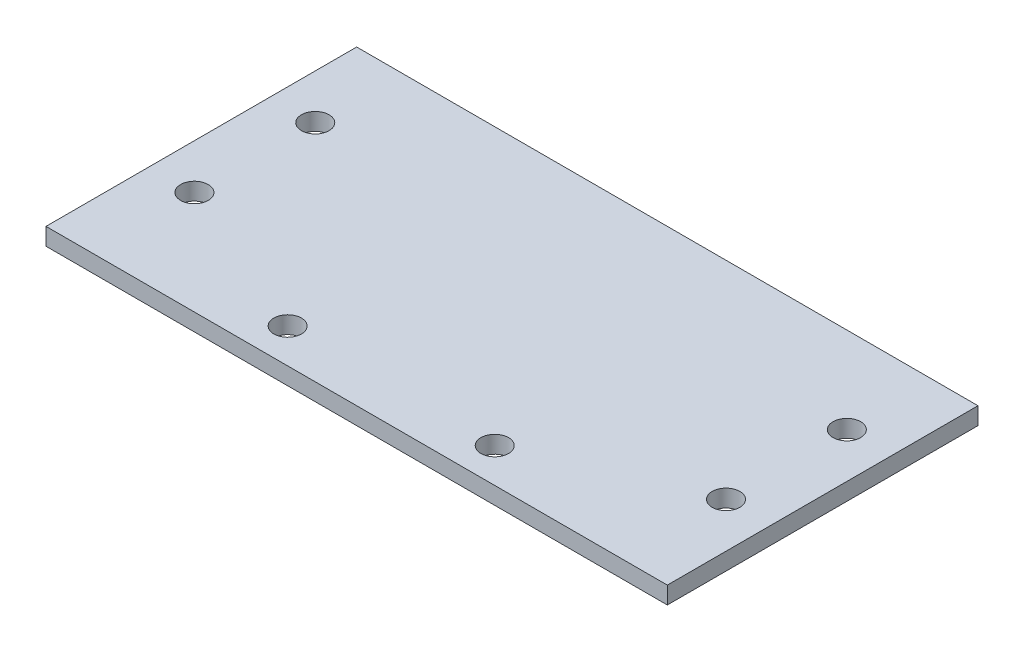
ISO-10303-21;
HEADER;
FILE_DESCRIPTION(('STEP AP214'),'2;1');
FILE_NAME('part.step','',(''),(''),'','','');
FILE_SCHEMA(('AUTOMOTIVE_DESIGN { 1 0 10303 214 1 1 1 1 }'));
ENDSEC;
DATA;
#1=APPLICATION_CONTEXT('core data for automotive mechanical design processes');
#2=APPLICATION_PROTOCOL_DEFINITION('international standard','automotive_design',2000,#1);
#3=PRODUCT_CONTEXT('',#1,'mechanical');
#4=PRODUCT('Part','Part','',(#3));
#5=PRODUCT_RELATED_PRODUCT_CATEGORY('part','',(#4));
#6=PRODUCT_DEFINITION_FORMATION('','',#4);
#7=PRODUCT_DEFINITION_CONTEXT('part definition',#1,'design');
#8=PRODUCT_DEFINITION('design','',#6,#7);
#9=PRODUCT_DEFINITION_SHAPE('','',#8);
#10=(LENGTH_UNIT() NAMED_UNIT(*) SI_UNIT(.MILLI.,.METRE.));
#11=(NAMED_UNIT(*) PLANE_ANGLE_UNIT() SI_UNIT($,.RADIAN.));
#12=(NAMED_UNIT(*) SI_UNIT($,.STERADIAN.) SOLID_ANGLE_UNIT());
#13=UNCERTAINTY_MEASURE_WITH_UNIT(LENGTH_MEASURE(1.E-05),#10,'distance_accuracy_value','');
#14=(GEOMETRIC_REPRESENTATION_CONTEXT(3) GLOBAL_UNCERTAINTY_ASSIGNED_CONTEXT((#13)) GLOBAL_UNIT_ASSIGNED_CONTEXT((#10,
#11,#12)) REPRESENTATION_CONTEXT('',''));
#15=CARTESIAN_POINT('',(0.,0.,0.));
#16=DIRECTION('',(0.,0.,1.));
#17=DIRECTION('',(1.,0.,0.));
#18=AXIS2_PLACEMENT_3D('',#15,#16,#17);
#19=CARTESIAN_POINT('',(0.,2.5,0.));
#20=DIRECTION('',(0.,-1.,0.));
#21=DIRECTION('',(0.,0.,-1.));
#22=AXIS2_PLACEMENT_3D('',#19,#20,#21);
#23=PLANE('',#22);
#24=DIRECTION('',(0.,0.,-1.));
#25=VECTOR('',#24,1.);
#26=CARTESIAN_POINT('',(90.,2.5,45.));
#27=LINE('',#26,#25);
#28=CARTESIAN_POINT('',(90.,2.5,45.));
#29=VERTEX_POINT('',#28);
#30=CARTESIAN_POINT('',(90.,2.5,-45.));
#31=VERTEX_POINT('',#30);
#32=EDGE_CURVE('E91',#29,#31,#27,.T.);
#33=ORIENTED_EDGE('',*,*,#32,.T.);
#34=DIRECTION('',(-1.,0.,0.));
#35=VECTOR('',#34,1.);
#36=CARTESIAN_POINT('',(-90.,2.5,-45.));
#37=LINE('',#36,#35);
#38=CARTESIAN_POINT('',(-90.,2.5,-45.));
#39=VERTEX_POINT('',#38);
#40=EDGE_CURVE('E86',#31,#39,#37,.T.);
#41=ORIENTED_EDGE('',*,*,#40,.T.);
#42=DIRECTION('',(0.,0.,1.));
#43=VECTOR('',#42,1.);
#44=CARTESIAN_POINT('',(-90.,2.5,45.));
#45=LINE('',#44,#43);
#46=CARTESIAN_POINT('',(-90.,2.5,45.));
#47=VERTEX_POINT('',#46);
#48=EDGE_CURVE('E89',#39,#47,#45,.T.);
#49=ORIENTED_EDGE('',*,*,#48,.T.);
#50=DIRECTION('',(1.,0.,0.));
#51=VECTOR('',#50,1.);
#52=CARTESIAN_POINT('',(-90.,2.5,45.));
#53=LINE('',#52,#51);
#54=EDGE_CURVE('E56',#47,#29,#53,.T.);
#55=ORIENTED_EDGE('',*,*,#54,.T.);
#56=EDGE_LOOP('',(#33,#41,#49,#55));
#57=FACE_BOUND('',#56,.T.);
#58=CARTESIAN_POINT('',(-77.,2.5,-20.));
#59=DIRECTION('',(0.,1.,0.));
#60=DIRECTION('',(0.,0.,1.));
#61=AXIS2_PLACEMENT_3D('',#58,#59,#60);
#62=CIRCLE('',#61,4.00000000000001);
#63=CARTESIAN_POINT('',(-77.,2.5,-16.));
#64=VERTEX_POINT('',#63);
#65=EDGE_CURVE('E106',#64,#64,#62,.T.);
#66=ORIENTED_EDGE('',*,*,#65,.F.);
#67=EDGE_LOOP('',(#66));
#68=FACE_BOUND('',#67,.T.);
#69=CARTESIAN_POINT('',(-77.,2.5,15.));
#70=DIRECTION('',(0.,1.,0.));
#71=DIRECTION('',(0.,0.,1.));
#72=AXIS2_PLACEMENT_3D('',#69,#70,#71);
#73=CIRCLE('',#72,4.00000000000001);
#74=CARTESIAN_POINT('',(-77.,2.5,19.));
#75=VERTEX_POINT('',#74);
#76=EDGE_CURVE('E121',#75,#75,#73,.T.);
#77=ORIENTED_EDGE('',*,*,#76,.F.);
#78=EDGE_LOOP('',(#77));
#79=FACE_BOUND('',#78,.T.);
#80=CARTESIAN_POINT('',(-30.,2.5,35.));
#81=DIRECTION('',(0.,1.,0.));
#82=DIRECTION('',(0.,0.,1.));
#83=AXIS2_PLACEMENT_3D('',#80,#81,#82);
#84=CIRCLE('',#83,4.);
#85=CARTESIAN_POINT('',(-30.,2.5,39.));
#86=VERTEX_POINT('',#85);
#87=EDGE_CURVE('E127',#86,#86,#84,.T.);
#88=ORIENTED_EDGE('',*,*,#87,.F.);
#89=EDGE_LOOP('',(#88));
#90=FACE_BOUND('',#89,.T.);
#91=CARTESIAN_POINT('',(30.,2.5,35.));
#92=DIRECTION('',(0.,1.,0.));
#93=DIRECTION('',(0.,0.,-1.));
#94=AXIS2_PLACEMENT_3D('',#91,#92,#93);
#95=CIRCLE('',#94,4.00000000000001);
#96=CARTESIAN_POINT('',(30.,2.5,31.));
#97=VERTEX_POINT('',#96);
#98=EDGE_CURVE('E133',#97,#97,#95,.T.);
#99=ORIENTED_EDGE('',*,*,#98,.F.);
#100=EDGE_LOOP('',(#99));
#101=FACE_BOUND('',#100,.T.);
#102=CARTESIAN_POINT('',(77.,2.5,-20.));
#103=DIRECTION('',(0.,1.,0.));
#104=DIRECTION('',(0.,0.,-1.));
#105=AXIS2_PLACEMENT_3D('',#102,#103,#104);
#106=CIRCLE('',#105,4.00000000000001);
#107=CARTESIAN_POINT('',(77.,2.5,-24.));
#108=VERTEX_POINT('',#107);
#109=EDGE_CURVE('E139',#108,#108,#106,.T.);
#110=ORIENTED_EDGE('',*,*,#109,.F.);
#111=EDGE_LOOP('',(#110));
#112=FACE_BOUND('',#111,.T.);
#113=CARTESIAN_POINT('',(77.,2.5,15.));
#114=DIRECTION('',(0.,1.,0.));
#115=DIRECTION('',(0.,0.,-1.));
#116=AXIS2_PLACEMENT_3D('',#113,#114,#115);
#117=CIRCLE('',#116,4.00000000000001);
#118=CARTESIAN_POINT('',(77.,2.5,11.));
#119=VERTEX_POINT('',#118);
#120=EDGE_CURVE('E145',#119,#119,#117,.T.);
#121=ORIENTED_EDGE('',*,*,#120,.F.);
#122=EDGE_LOOP('',(#121));
#123=FACE_BOUND('',#122,.T.);
#124=ADVANCED_FACE('F39',(#57,#68,#79,#90,#101,#112,#123),#23,.F.);
#125=CARTESIAN_POINT('',(0.,-2.5,0.));
#126=DIRECTION('',(0.,-1.,0.));
#127=DIRECTION('',(0.,0.,-1.));
#128=AXIS2_PLACEMENT_3D('',#125,#126,#127);
#129=PLANE('',#128);
#130=CARTESIAN_POINT('',(77.,-2.5,-20.));
#131=DIRECTION('',(0.,1.,0.));
#132=DIRECTION('',(0.,0.,-1.));
#133=AXIS2_PLACEMENT_3D('',#130,#131,#132);
#134=CIRCLE('',#133,4.00000000000001);
#135=CARTESIAN_POINT('',(77.,-2.5,-24.));
#136=VERTEX_POINT('',#135);
#137=EDGE_CURVE('E142',#136,#136,#134,.T.);
#138=ORIENTED_EDGE('',*,*,#137,.T.);
#139=EDGE_LOOP('',(#138));
#140=FACE_BOUND('',#139,.T.);
#141=CARTESIAN_POINT('',(-30.,-2.5,35.));
#142=DIRECTION('',(0.,1.,0.));
#143=DIRECTION('',(0.,0.,1.));
#144=AXIS2_PLACEMENT_3D('',#141,#142,#143);
#145=CIRCLE('',#144,4.);
#146=CARTESIAN_POINT('',(-30.,-2.5,39.));
#147=VERTEX_POINT('',#146);
#148=EDGE_CURVE('E130',#147,#147,#145,.T.);
#149=ORIENTED_EDGE('',*,*,#148,.T.);
#150=EDGE_LOOP('',(#149));
#151=FACE_BOUND('',#150,.T.);
#152=CARTESIAN_POINT('',(-77.,-2.5,-20.));
#153=DIRECTION('',(0.,1.,0.));
#154=DIRECTION('',(0.,0.,1.));
#155=AXIS2_PLACEMENT_3D('',#152,#153,#154);
#156=CIRCLE('',#155,4.00000000000001);
#157=CARTESIAN_POINT('',(-77.,-2.5,-16.));
#158=VERTEX_POINT('',#157);
#159=EDGE_CURVE('E118',#158,#158,#156,.T.);
#160=ORIENTED_EDGE('',*,*,#159,.T.);
#161=EDGE_LOOP('',(#160));
#162=FACE_BOUND('',#161,.T.);
#163=DIRECTION('',(0.,0.,-1.));
#164=VECTOR('',#163,1.);
#165=CARTESIAN_POINT('',(90.,-2.5,45.));
#166=LINE('',#165,#164);
#167=CARTESIAN_POINT('',(90.,-2.5,45.));
#168=VERTEX_POINT('',#167);
#169=CARTESIAN_POINT('',(90.,-2.5,-45.));
#170=VERTEX_POINT('',#169);
#171=EDGE_CURVE('E103',#168,#170,#166,.T.);
#172=ORIENTED_EDGE('',*,*,#171,.F.);
#173=DIRECTION('',(1.,0.,0.));
#174=VECTOR('',#173,1.);
#175=CARTESIAN_POINT('',(-90.,-2.5,45.));
#176=LINE('',#175,#174);
#177=CARTESIAN_POINT('',(-90.,-2.5,45.));
#178=VERTEX_POINT('',#177);
#179=EDGE_CURVE('E79',#178,#168,#176,.T.);
#180=ORIENTED_EDGE('',*,*,#179,.F.);
#181=DIRECTION('',(0.,0.,1.));
#182=VECTOR('',#181,1.);
#183=CARTESIAN_POINT('',(-90.,-2.5,45.));
#184=LINE('',#183,#182);
#185=CARTESIAN_POINT('',(-90.,-2.5,-45.));
#186=VERTEX_POINT('',#185);
#187=EDGE_CURVE('E73',#186,#178,#184,.T.);
#188=ORIENTED_EDGE('',*,*,#187,.F.);
#189=DIRECTION('',(-1.,0.,0.));
#190=VECTOR('',#189,1.);
#191=CARTESIAN_POINT('',(-90.,-2.5,-45.));
#192=LINE('',#191,#190);
#193=EDGE_CURVE('E95',#170,#186,#192,.T.);
#194=ORIENTED_EDGE('',*,*,#193,.F.);
#195=EDGE_LOOP('',(#172,#180,#188,#194));
#196=FACE_BOUND('',#195,.T.);
#197=CARTESIAN_POINT('',(-77.,-2.5,15.));
#198=DIRECTION('',(0.,1.,0.));
#199=DIRECTION('',(0.,0.,1.));
#200=AXIS2_PLACEMENT_3D('',#197,#198,#199);
#201=CIRCLE('',#200,4.00000000000001);
#202=CARTESIAN_POINT('',(-77.,-2.5,19.));
#203=VERTEX_POINT('',#202);
#204=EDGE_CURVE('E124',#203,#203,#201,.T.);
#205=ORIENTED_EDGE('',*,*,#204,.T.);
#206=EDGE_LOOP('',(#205));
#207=FACE_BOUND('',#206,.T.);
#208=CARTESIAN_POINT('',(30.,-2.5,35.));
#209=DIRECTION('',(0.,1.,0.));
#210=DIRECTION('',(0.,0.,-1.));
#211=AXIS2_PLACEMENT_3D('',#208,#209,#210);
#212=CIRCLE('',#211,4.00000000000001);
#213=CARTESIAN_POINT('',(30.,-2.5,31.));
#214=VERTEX_POINT('',#213);
#215=EDGE_CURVE('E136',#214,#214,#212,.T.);
#216=ORIENTED_EDGE('',*,*,#215,.T.);
#217=EDGE_LOOP('',(#216));
#218=FACE_BOUND('',#217,.T.);
#219=CARTESIAN_POINT('',(77.,-2.5,15.));
#220=DIRECTION('',(0.,1.,0.));
#221=DIRECTION('',(0.,0.,-1.));
#222=AXIS2_PLACEMENT_3D('',#219,#220,#221);
#223=CIRCLE('',#222,4.00000000000001);
#224=CARTESIAN_POINT('',(77.,-2.5,11.));
#225=VERTEX_POINT('',#224);
#226=EDGE_CURVE('E148',#225,#225,#223,.T.);
#227=ORIENTED_EDGE('',*,*,#226,.T.);
#228=EDGE_LOOP('',(#227));
#229=FACE_BOUND('',#228,.T.);
#230=ADVANCED_FACE('F114',(#140,#151,#162,#196,#207,#218,#229),#129,.T.);
#231=CARTESIAN_POINT('',(90.,2.5,45.));
#232=DIRECTION('',(-1.,0.,0.));
#233=DIRECTION('',(0.,0.,1.));
#234=AXIS2_PLACEMENT_3D('',#231,#232,#233);
#235=PLANE('',#234);
#236=ORIENTED_EDGE('',*,*,#171,.T.);
#237=DIRECTION('',(0.,-1.,0.));
#238=VECTOR('',#237,1.);
#239=CARTESIAN_POINT('',(90.,2.5,-45.));
#240=LINE('',#239,#238);
#241=EDGE_CURVE('E11',#31,#170,#240,.T.);
#242=ORIENTED_EDGE('',*,*,#241,.F.);
#243=ORIENTED_EDGE('',*,*,#32,.F.);
#244=DIRECTION('',(0.,-1.,0.));
#245=VECTOR('',#244,1.);
#246=CARTESIAN_POINT('',(90.,2.5,45.));
#247=LINE('',#246,#245);
#248=EDGE_CURVE('E99',#29,#168,#247,.T.);
#249=ORIENTED_EDGE('',*,*,#248,.T.);
#250=EDGE_LOOP('',(#236,#242,#243,#249));
#251=FACE_BOUND('',#250,.T.);
#252=ADVANCED_FACE('F41',(#251),#235,.F.);
#253=CARTESIAN_POINT('',(-90.,2.5,-45.));
#254=DIRECTION('',(0.,0.,1.));
#255=DIRECTION('',(1.,0.,0.));
#256=AXIS2_PLACEMENT_3D('',#253,#254,#255);
#257=PLANE('',#256);
#258=ORIENTED_EDGE('',*,*,#193,.T.);
#259=DIRECTION('',(0.,-1.,0.));
#260=VECTOR('',#259,1.);
#261=CARTESIAN_POINT('',(-90.,2.5,-45.));
#262=LINE('',#261,#260);
#263=EDGE_CURVE('E48',#39,#186,#262,.T.);
#264=ORIENTED_EDGE('',*,*,#263,.F.);
#265=ORIENTED_EDGE('',*,*,#40,.F.);
#266=ORIENTED_EDGE('',*,*,#241,.T.);
#267=EDGE_LOOP('',(#258,#264,#265,#266));
#268=FACE_BOUND('',#267,.T.);
#269=ADVANCED_FACE('F94',(#268),#257,.F.);
#270=CARTESIAN_POINT('',(-90.,2.5,45.));
#271=DIRECTION('',(1.,0.,0.));
#272=DIRECTION('',(0.,0.,-1.));
#273=AXIS2_PLACEMENT_3D('',#270,#271,#272);
#274=PLANE('',#273);
#275=ORIENTED_EDGE('',*,*,#187,.T.);
#276=DIRECTION('',(0.,-1.,0.));
#277=VECTOR('',#276,1.);
#278=CARTESIAN_POINT('',(-90.,2.5,45.));
#279=LINE('',#278,#277);
#280=EDGE_CURVE('E96',#47,#178,#279,.T.);
#281=ORIENTED_EDGE('',*,*,#280,.F.);
#282=ORIENTED_EDGE('',*,*,#48,.F.);
#283=ORIENTED_EDGE('',*,*,#263,.T.);
#284=EDGE_LOOP('',(#275,#281,#282,#283));
#285=FACE_BOUND('',#284,.T.);
#286=ADVANCED_FACE('F97',(#285),#274,.F.);
#287=CARTESIAN_POINT('',(-90.,2.5,45.));
#288=DIRECTION('',(0.,0.,-1.));
#289=DIRECTION('',(-1.,0.,0.));
#290=AXIS2_PLACEMENT_3D('',#287,#288,#289);
#291=PLANE('',#290);
#292=ORIENTED_EDGE('',*,*,#179,.T.);
#293=ORIENTED_EDGE('',*,*,#248,.F.);
#294=ORIENTED_EDGE('',*,*,#54,.F.);
#295=ORIENTED_EDGE('',*,*,#280,.T.);
#296=EDGE_LOOP('',(#292,#293,#294,#295));
#297=FACE_BOUND('',#296,.T.);
#298=ADVANCED_FACE('F111',(#297),#291,.F.);
#299=CARTESIAN_POINT('',(-77.,2.5,-20.));
#300=DIRECTION('',(0.,-1.,0.));
#301=DIRECTION('',(0.,0.,-1.));
#302=AXIS2_PLACEMENT_3D('',#299,#300,#301);
#303=CYLINDRICAL_SURFACE('',#302,4.00000000000001);
#304=ORIENTED_EDGE('',*,*,#65,.T.);
#305=EDGE_LOOP('',(#304));
#306=FACE_BOUND('',#305,.T.);
#307=ORIENTED_EDGE('',*,*,#159,.F.);
#308=EDGE_LOOP('',(#307));
#309=FACE_BOUND('',#308,.T.);
#310=ADVANCED_FACE('F165',(#306,#309),#303,.F.);
#311=CARTESIAN_POINT('',(-77.,2.5,15.));
#312=DIRECTION('',(0.,-1.,0.));
#313=DIRECTION('',(0.,0.,-1.));
#314=AXIS2_PLACEMENT_3D('',#311,#312,#313);
#315=CYLINDRICAL_SURFACE('',#314,4.00000000000001);
#316=ORIENTED_EDGE('',*,*,#76,.T.);
#317=EDGE_LOOP('',(#316));
#318=FACE_BOUND('',#317,.T.);
#319=ORIENTED_EDGE('',*,*,#204,.F.);
#320=EDGE_LOOP('',(#319));
#321=FACE_BOUND('',#320,.T.);
#322=ADVANCED_FACE('F210',(#318,#321),#315,.F.);
#323=CARTESIAN_POINT('',(-30.,2.5,35.));
#324=DIRECTION('',(0.,-1.,0.));
#325=DIRECTION('',(0.,0.,-1.));
#326=AXIS2_PLACEMENT_3D('',#323,#324,#325);
#327=CYLINDRICAL_SURFACE('',#326,4.);
#328=ORIENTED_EDGE('',*,*,#87,.T.);
#329=EDGE_LOOP('',(#328));
#330=FACE_BOUND('',#329,.T.);
#331=ORIENTED_EDGE('',*,*,#148,.F.);
#332=EDGE_LOOP('',(#331));
#333=FACE_BOUND('',#332,.T.);
#334=ADVANCED_FACE('F218',(#330,#333),#327,.F.);
#335=CARTESIAN_POINT('',(30.,2.5,35.));
#336=DIRECTION('',(0.,-1.,0.));
#337=DIRECTION('',(0.,0.,-1.));
#338=AXIS2_PLACEMENT_3D('',#335,#336,#337);
#339=CYLINDRICAL_SURFACE('',#338,4.00000000000001);
#340=ORIENTED_EDGE('',*,*,#98,.T.);
#341=EDGE_LOOP('',(#340));
#342=FACE_BOUND('',#341,.T.);
#343=ORIENTED_EDGE('',*,*,#215,.F.);
#344=EDGE_LOOP('',(#343));
#345=FACE_BOUND('',#344,.T.);
#346=ADVANCED_FACE('F226',(#342,#345),#339,.F.);
#347=CARTESIAN_POINT('',(77.,2.5,-20.));
#348=DIRECTION('',(0.,-1.,0.));
#349=DIRECTION('',(0.,0.,-1.));
#350=AXIS2_PLACEMENT_3D('',#347,#348,#349);
#351=CYLINDRICAL_SURFACE('',#350,4.00000000000001);
#352=ORIENTED_EDGE('',*,*,#109,.T.);
#353=EDGE_LOOP('',(#352));
#354=FACE_BOUND('',#353,.T.);
#355=ORIENTED_EDGE('',*,*,#137,.F.);
#356=EDGE_LOOP('',(#355));
#357=FACE_BOUND('',#356,.T.);
#358=ADVANCED_FACE('F235',(#354,#357),#351,.F.);
#359=CARTESIAN_POINT('',(77.,2.5,15.));
#360=DIRECTION('',(0.,-1.,0.));
#361=DIRECTION('',(0.,0.,-1.));
#362=AXIS2_PLACEMENT_3D('',#359,#360,#361);
#363=CYLINDRICAL_SURFACE('',#362,4.00000000000001);
#364=ORIENTED_EDGE('',*,*,#120,.T.);
#365=EDGE_LOOP('',(#364));
#366=FACE_BOUND('',#365,.T.);
#367=ORIENTED_EDGE('',*,*,#226,.F.);
#368=EDGE_LOOP('',(#367));
#369=FACE_BOUND('',#368,.T.);
#370=ADVANCED_FACE('F154',(#366,#369),#363,.F.);
#371=CLOSED_SHELL('',(#124,#230,#252,#269,#286,#298,#310,#322,#334,#346,#358,#370));
#372=MANIFOLD_SOLID_BREP('B2',#371);
#373=ADVANCED_BREP_SHAPE_REPRESENTATION('',(#18,#372),#14);
#374=SHAPE_DEFINITION_REPRESENTATION(#9,#373);
ENDSEC;
END-ISO-10303-21;
